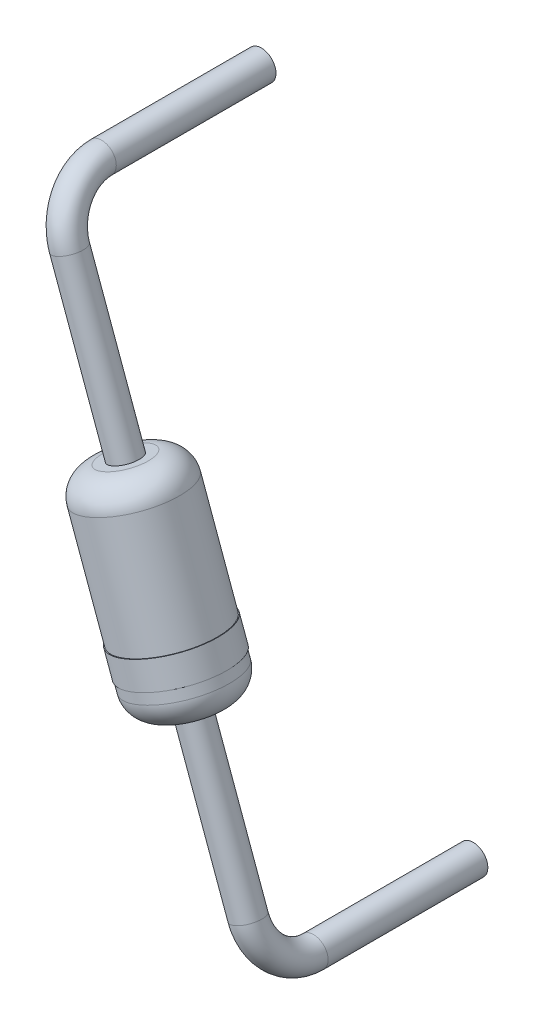
ISO-10303-21;
HEADER;
FILE_DESCRIPTION(('STEP AP214'),'2;1');
FILE_NAME('part.step','',(''),(''),'','','');
FILE_SCHEMA(('AUTOMOTIVE_DESIGN { 1 0 10303 214 1 1 1 1 }'));
ENDSEC;
DATA;
#1=APPLICATION_CONTEXT('core data for automotive mechanical design processes');
#2=APPLICATION_PROTOCOL_DEFINITION('international standard','automotive_design',2000,#1);
#3=PRODUCT_CONTEXT('',#1,'mechanical');
#4=PRODUCT('Part','Part','',(#3));
#5=PRODUCT_RELATED_PRODUCT_CATEGORY('part','',(#4));
#6=PRODUCT_DEFINITION_FORMATION('','',#4);
#7=PRODUCT_DEFINITION_CONTEXT('part definition',#1,'design');
#8=PRODUCT_DEFINITION('design','',#6,#7);
#9=PRODUCT_DEFINITION_SHAPE('','',#8);
#10=(LENGTH_UNIT() NAMED_UNIT(*) SI_UNIT(.MILLI.,.METRE.));
#11=(NAMED_UNIT(*) PLANE_ANGLE_UNIT() SI_UNIT($,.RADIAN.));
#12=(NAMED_UNIT(*) SI_UNIT($,.STERADIAN.) SOLID_ANGLE_UNIT());
#13=UNCERTAINTY_MEASURE_WITH_UNIT(LENGTH_MEASURE(1.E-05),#10,'distance_accuracy_value','');
#14=(GEOMETRIC_REPRESENTATION_CONTEXT(3) GLOBAL_UNCERTAINTY_ASSIGNED_CONTEXT((#13)) GLOBAL_UNIT_ASSIGNED_CONTEXT((#10,
#11,#12)) REPRESENTATION_CONTEXT('',''));
#15=CARTESIAN_POINT('',(0.,0.,0.));
#16=DIRECTION('',(0.,0.,1.));
#17=DIRECTION('',(1.,0.,0.));
#18=AXIS2_PLACEMENT_3D('',#15,#16,#17);
#19=CARTESIAN_POINT('',(56.8879259441125,23.3375751807859,0.1127));
#20=DIRECTION('',(-0.939692620785813,-0.342020143325932,0.));
#21=DIRECTION('',(0.,0.,1.));
#22=AXIS2_PLACEMENT_3D('',#19,#20,#21);
#23=TOROIDAL_SURFACE('',#22,1.,0.3);
#24=CARTESIAN_POINT('',(57.2299460874384,22.39788256,0.1127));
#25=DIRECTION('',(0.,0.,-1.));
#26=DIRECTION('',(0.342020143325932,-0.939692620785813,0.));
#27=AXIS2_PLACEMENT_3D('',#24,#25,#26);
#28=CIRCLE('',#27,0.3);
#29=CARTESIAN_POINT('',(57.1273400444406,22.6797903462358,0.1127));
#30=VERTEX_POINT('',#29);
#31=EDGE_CURVE('E40',#30,#30,#28,.T.);
#32=ORIENTED_EDGE('',*,*,#31,.F.);
#33=EDGE_LOOP('',(#32));
#34=FACE_BOUND('',#33,.T.);
#35=CARTESIAN_POINT('',(56.8879259441125,23.3375751807859,1.1127));
#36=DIRECTION('',(0.342020143325932,-0.939692620785813,0.));
#37=DIRECTION('',(0.,0.,1.));
#38=AXIS2_PLACEMENT_3D('',#35,#36,#37);
#39=CIRCLE('',#38,0.3);
#40=CARTESIAN_POINT('',(56.8879259441125,23.3375751807859,0.8127));
#41=VERTEX_POINT('',#40);
#42=EDGE_CURVE('E11',#41,#41,#39,.T.);
#43=ORIENTED_EDGE('',*,*,#42,.T.);
#44=EDGE_LOOP('',(#43));
#45=FACE_BOUND('',#44,.T.);
#46=ADVANCED_FACE('F16',(#34,#45),#23,.T.);
#47=CARTESIAN_POINT('',(53.228310410525,33.3922862231941,0.1127));
#48=DIRECTION('',(0.939692620785813,0.342020143325932,0.));
#49=DIRECTION('',(0.,0.,-1.));
#50=AXIS2_PLACEMENT_3D('',#47,#48,#49);
#51=TOROIDAL_SURFACE('',#50,1.,0.3);
#52=CARTESIAN_POINT('',(52.8862902671991,34.3319788439798,0.1127));
#53=DIRECTION('',(0.,0.,-1.));
#54=DIRECTION('',(0.342020143325932,-0.939692620785813,0.));
#55=AXIS2_PLACEMENT_3D('',#52,#53,#54);
#56=CIRCLE('',#55,0.3);
#57=CARTESIAN_POINT('',(52.9888963101969,34.0500710577441,0.1127));
#58=VERTEX_POINT('',#57);
#59=EDGE_CURVE('E120',#58,#58,#56,.T.);
#60=ORIENTED_EDGE('',*,*,#59,.F.);
#61=EDGE_LOOP('',(#60));
#62=FACE_BOUND('',#61,.T.);
#63=CARTESIAN_POINT('',(53.228310410525,33.3922862231941,1.1127));
#64=DIRECTION('',(-0.342020143325932,0.939692620785813,0.));
#65=DIRECTION('',(0.,0.,-1.));
#66=AXIS2_PLACEMENT_3D('',#63,#64,#65);
#67=CIRCLE('',#66,0.3);
#68=CARTESIAN_POINT('',(53.228310410525,33.3922862231941,0.8127));
#69=VERTEX_POINT('',#68);
#70=EDGE_CURVE('E27',#69,#69,#67,.T.);
#71=ORIENTED_EDGE('',*,*,#70,.T.);
#72=EDGE_LOOP('',(#71));
#73=FACE_BOUND('',#72,.T.);
#74=ADVANCED_FACE('F178',(#62,#73),#51,.T.);
#75=CARTESIAN_POINT('',(52.8862902671991,34.3319788439798,0.0127000000000011));
#76=DIRECTION('',(0.,0.,-1.));
#77=DIRECTION('',(0.342020143325932,-0.939692620785813,0.));
#78=AXIS2_PLACEMENT_3D('',#75,#76,#77);
#79=CYLINDRICAL_SURFACE('',#78,0.3);
#80=ORIENTED_EDGE('',*,*,#59,.T.);
#81=EDGE_LOOP('',(#80));
#82=FACE_BOUND('',#81,.T.);
#83=CARTESIAN_POINT('',(52.8862902671991,34.3319788439798,-3.1623));
#84=DIRECTION('',(0.,0.,1.));
#85=DIRECTION('',(0.342020143325932,-0.939692620785813,0.));
#86=AXIS2_PLACEMENT_3D('',#83,#84,#85);
#87=CIRCLE('',#86,0.3);
#88=CARTESIAN_POINT('',(52.9888963101969,34.0500710577441,-3.1623));
#89=VERTEX_POINT('',#88);
#90=EDGE_CURVE('E117',#89,#89,#87,.T.);
#91=ORIENTED_EDGE('',*,*,#90,.T.);
#92=EDGE_LOOP('',(#91));
#93=FACE_BOUND('',#92,.T.);
#94=ADVANCED_FACE('F184',(#82,#93),#79,.T.);
#95=CARTESIAN_POINT('',(57.2299460874384,22.39788256,0.0127000000000011));
#96=DIRECTION('',(0.,0.,-1.));
#97=DIRECTION('',(0.342020143325932,-0.939692620785813,0.));
#98=AXIS2_PLACEMENT_3D('',#95,#96,#97);
#99=CYLINDRICAL_SURFACE('',#98,0.3);
#100=ORIENTED_EDGE('',*,*,#31,.T.);
#101=EDGE_LOOP('',(#100));
#102=FACE_BOUND('',#101,.T.);
#103=CARTESIAN_POINT('',(57.2299460874384,22.39788256,-3.1623));
#104=DIRECTION('',(0.,0.,1.));
#105=DIRECTION('',(0.342020143325932,-0.939692620785813,0.));
#106=AXIS2_PLACEMENT_3D('',#103,#104,#105);
#107=CIRCLE('',#106,0.3);
#108=CARTESIAN_POINT('',(57.3325521304362,22.1159747737643,-3.1623));
#109=VERTEX_POINT('',#108);
#110=EDGE_CURVE('E128',#109,#109,#107,.T.);
#111=ORIENTED_EDGE('',*,*,#110,.T.);
#112=EDGE_LOOP('',(#111));
#113=FACE_BOUND('',#112,.T.);
#114=ADVANCED_FACE('F191',(#102,#113),#99,.T.);
#115=CARTESIAN_POINT('',(55.5711483923077,26.9553917708113,1.1127));
#116=DIRECTION('',(0.342020143325932,-0.939692620785813,0.));
#117=DIRECTION('',(0.,0.,1.));
#118=AXIS2_PLACEMENT_3D('',#115,#116,#117);
#119=DEGENERATE_TOROIDAL_SURFACE('',#118,0.5,0.5,.T.);
#120=CARTESIAN_POINT('',(55.5711483923077,26.9553917708113,1.1127));
#121=DIRECTION('',(0.342020143325932,-0.939692620785813,0.));
#122=DIRECTION('',(0.,0.,1.));
#123=AXIS2_PLACEMENT_3D('',#120,#121,#122);
#124=CIRCLE('',#123,1.);
#125=CARTESIAN_POINT('',(55.5711483923077,26.9553917708113,0.112700000000001));
#126=VERTEX_POINT('',#125);
#127=EDGE_CURVE('E135',#126,#126,#124,.T.);
#128=ORIENTED_EDGE('',*,*,#127,.T.);
#129=EDGE_LOOP('',(#128));
#130=FACE_BOUND('',#129,.T.);
#131=CARTESIAN_POINT('',(55.7421584639706,26.4855454604183,1.1127));
#132=DIRECTION('',(0.342020143325932,-0.939692620785813,0.));
#133=DIRECTION('',(0.,0.,1.));
#134=AXIS2_PLACEMENT_3D('',#131,#132,#133);
#135=CIRCLE('',#134,0.5);
#136=CARTESIAN_POINT('',(55.7421584639706,26.4855454604183,1.6127));
#137=VERTEX_POINT('',#136);
#138=EDGE_CURVE('E114',#137,#137,#135,.T.);
#139=ORIENTED_EDGE('',*,*,#138,.F.);
#140=EDGE_LOOP('',(#139));
#141=FACE_BOUND('',#140,.T.);
#142=ADVANCED_FACE('F197',(#130,#141),#119,.T.);
#143=CARTESIAN_POINT('',(55.0581181773188,28.3649307019899,1.1127));
#144=DIRECTION('',(0.342020143325932,-0.939692620785813,0.));
#145=DIRECTION('',(0.,0.,1.));
#146=AXIS2_PLACEMENT_3D('',#143,#144,#145);
#147=CYLINDRICAL_SURFACE('',#146,1.);
#148=CARTESIAN_POINT('',(55.4997147438179,27.151654107026,1.1127));
#149=DIRECTION('',(0.342020143325932,-0.939692620785813,0.));
#150=DIRECTION('',(0.,0.,1.));
#151=AXIS2_PLACEMENT_3D('',#148,#149,#150);
#152=CIRCLE('',#151,1.);
#153=CARTESIAN_POINT('',(55.4997147438179,27.151654107026,0.112700000000001));
#154=VERTEX_POINT('',#153);
#155=EDGE_CURVE('E140',#154,#154,#152,.T.);
#156=ORIENTED_EDGE('',*,*,#155,.T.);
#157=EDGE_LOOP('',(#156));
#158=FACE_BOUND('',#157,.T.);
#159=ORIENTED_EDGE('',*,*,#127,.F.);
#160=EDGE_LOOP('',(#159));
#161=FACE_BOUND('',#160,.T.);
#162=ADVANCED_FACE('F158',(#158,#161),#147,.T.);
#163=CARTESIAN_POINT('',(54.5450879623299,29.7744696331686,1.1127));
#164=DIRECTION('',(0.342020143325932,-0.939692620785813,0.));
#165=DIRECTION('',(0.,0.,1.));
#166=AXIS2_PLACEMENT_3D('',#163,#164,#165);
#167=DEGENERATE_TOROIDAL_SURFACE('',#166,0.5,0.5,.T.);
#168=CARTESIAN_POINT('',(54.3740778906669,30.2443159435615,1.1127));
#169=DIRECTION('',(0.342020143325932,-0.939692620785813,0.));
#170=DIRECTION('',(0.,0.,1.));
#171=AXIS2_PLACEMENT_3D('',#168,#169,#170);
#172=CIRCLE('',#171,0.5);
#173=CARTESIAN_POINT('',(54.3740778906669,30.2443159435615,0.6127));
#174=VERTEX_POINT('',#173);
#175=EDGE_CURVE('E107',#174,#174,#172,.T.);
#176=ORIENTED_EDGE('',*,*,#175,.T.);
#177=EDGE_LOOP('',(#176));
#178=FACE_BOUND('',#177,.T.);
#179=CARTESIAN_POINT('',(54.5450879623299,29.7744696331686,1.1127));
#180=DIRECTION('',(0.342020143325932,-0.939692620785813,0.));
#181=DIRECTION('',(0.,0.,1.));
#182=AXIS2_PLACEMENT_3D('',#179,#180,#181);
#183=CIRCLE('',#182,1.);
#184=CARTESIAN_POINT('',(54.5450879623299,29.7744696331686,2.1127));
#185=VERTEX_POINT('',#184);
#186=EDGE_CURVE('E98',#185,#185,#183,.T.);
#187=ORIENTED_EDGE('',*,*,#186,.F.);
#188=EDGE_LOOP('',(#187));
#189=FACE_BOUND('',#188,.T.);
#190=ADVANCED_FACE('F196',(#178,#189),#167,.T.);
#191=CARTESIAN_POINT('',(55.0581181773188,28.3649307019899,1.1127));
#192=DIRECTION('',(0.342020143325932,-0.939692620785813,0.));
#193=DIRECTION('',(0.,0.,1.));
#194=AXIS2_PLACEMENT_3D('',#191,#192,#193);
#195=CYLINDRICAL_SURFACE('',#194,1.);
#196=ORIENTED_EDGE('',*,*,#186,.T.);
#197=EDGE_LOOP('',(#196));
#198=FACE_BOUND('',#197,.T.);
#199=CARTESIAN_POINT('',(55.3177367192757,27.6516346202922,1.1127));
#200=DIRECTION('',(-0.342020143325932,0.939692620785813,0.));
#201=DIRECTION('',(0.,0.,1.));
#202=AXIS2_PLACEMENT_3D('',#199,#200,#201);
#203=CIRCLE('',#202,1.);
#204=CARTESIAN_POINT('',(55.3177367192757,27.6516346202922,2.1127));
#205=VERTEX_POINT('',#204);
#206=EDGE_CURVE('E95',#205,#205,#203,.T.);
#207=ORIENTED_EDGE('',*,*,#206,.T.);
#208=EDGE_LOOP('',(#207));
#209=FACE_BOUND('',#208,.T.);
#210=ADVANCED_FACE('F204',(#198,#209),#195,.T.);
#211=CARTESIAN_POINT('',(55.4087257315466,27.4016443636595,1.1127));
#212=DIRECTION('',(0.342020143325932,-0.939692620785813,0.));
#213=DIRECTION('',(0.,0.,1.));
#214=AXIS2_PLACEMENT_3D('',#211,#212,#213);
#215=CYLINDRICAL_SURFACE('',#214,1.017447467414);
#216=CARTESIAN_POINT('',(55.3177367192757,27.6516346202922,1.1127));
#217=DIRECTION('',(0.342020143325932,-0.939692620785813,0.));
#218=DIRECTION('',(0.,0.,1.));
#219=AXIS2_PLACEMENT_3D('',#216,#217,#218);
#220=CIRCLE('',#219,1.017447467414);
#221=CARTESIAN_POINT('',(55.3177367192757,27.6516346202922,0.0952525325860012));
#222=VERTEX_POINT('',#221);
#223=EDGE_CURVE('E99',#222,#222,#220,.T.);
#224=ORIENTED_EDGE('',*,*,#223,.T.);
#225=EDGE_LOOP('',(#224));
#226=FACE_BOUND('',#225,.T.);
#227=CARTESIAN_POINT('',(55.4997147438179,27.151654107026,1.1127));
#228=DIRECTION('',(0.342020143325932,-0.939692620785813,0.));
#229=DIRECTION('',(0.,0.,1.));
#230=AXIS2_PLACEMENT_3D('',#227,#228,#229);
#231=CIRCLE('',#230,1.017447467414);
#232=CARTESIAN_POINT('',(55.4997147438179,27.151654107026,2.130147467414));
#233=VERTEX_POINT('',#232);
#234=EDGE_CURVE('E110',#233,#233,#231,.T.);
#235=ORIENTED_EDGE('',*,*,#234,.F.);
#236=EDGE_LOOP('',(#235));
#237=FACE_BOUND('',#236,.T.);
#238=ADVANCED_FACE('F189',(#226,#237),#215,.T.);
#239=CARTESIAN_POINT('',(56.8879259441125,23.3375751807859,1.1127));
#240=DIRECTION('',(-0.342020143325932,0.939692620785813,0.));
#241=DIRECTION('',(0.,0.,1.));
#242=AXIS2_PLACEMENT_3D('',#239,#240,#241);
#243=CYLINDRICAL_SURFACE('',#242,0.3);
#244=ORIENTED_EDGE('',*,*,#42,.F.);
#245=EDGE_LOOP('',(#244));
#246=FACE_BOUND('',#245,.T.);
#247=CARTESIAN_POINT('',(55.7421584639706,26.4855454604183,1.1127));
#248=DIRECTION('',(-0.342020143325932,0.939692620785813,0.));
#249=DIRECTION('',(0.,0.,1.));
#250=AXIS2_PLACEMENT_3D('',#247,#248,#249);
#251=CIRCLE('',#250,0.3);
#252=CARTESIAN_POINT('',(55.7421584639706,26.4855454604183,1.4127));
#253=VERTEX_POINT('',#252);
#254=EDGE_CURVE('E142',#253,#253,#251,.T.);
#255=ORIENTED_EDGE('',*,*,#254,.F.);
#256=EDGE_LOOP('',(#255));
#257=FACE_BOUND('',#256,.T.);
#258=ADVANCED_FACE('F172',(#246,#257),#243,.T.);
#259=CARTESIAN_POINT('',(53.228310410525,33.3922862231941,1.1127));
#260=DIRECTION('',(0.342020143325932,-0.939692620785813,0.));
#261=DIRECTION('',(0.,0.,-1.));
#262=AXIS2_PLACEMENT_3D('',#259,#260,#261);
#263=CYLINDRICAL_SURFACE('',#262,0.3);
#264=ORIENTED_EDGE('',*,*,#70,.F.);
#265=EDGE_LOOP('',(#264));
#266=FACE_BOUND('',#265,.T.);
#267=CARTESIAN_POINT('',(54.3740778906669,30.2443159435615,1.1127));
#268=DIRECTION('',(0.342020143325932,-0.939692620785813,0.));
#269=DIRECTION('',(0.,0.,-1.));
#270=AXIS2_PLACEMENT_3D('',#267,#268,#269);
#271=CIRCLE('',#270,0.3);
#272=CARTESIAN_POINT('',(54.3740778906669,30.2443159435615,0.8127));
#273=VERTEX_POINT('',#272);
#274=EDGE_CURVE('E20',#273,#273,#271,.T.);
#275=ORIENTED_EDGE('',*,*,#274,.F.);
#276=EDGE_LOOP('',(#275));
#277=FACE_BOUND('',#276,.T.);
#278=ADVANCED_FACE('F163',(#266,#277),#263,.T.);
#279=CARTESIAN_POINT('',(55.4997147438179,27.151654107026,2.102450753973));
#280=DIRECTION('',(0.342020143325932,-0.939692620785813,0.));
#281=DIRECTION('',(0.,0.,1.));
#282=AXIS2_PLACEMENT_3D('',#279,#280,#281);
#283=PLANE('',#282);
#284=ORIENTED_EDGE('',*,*,#234,.T.);
#285=EDGE_LOOP('',(#284));
#286=FACE_BOUND('',#285,.T.);
#287=ORIENTED_EDGE('',*,*,#155,.F.);
#288=EDGE_LOOP('',(#287));
#289=FACE_BOUND('',#288,.T.);
#290=ADVANCED_FACE('F161',(#286,#289),#283,.T.);
#291=CARTESIAN_POINT('',(55.3177367192757,27.6516346202922,2.102450753973));
#292=DIRECTION('',(-0.342020143325932,0.939692620785813,0.));
#293=DIRECTION('',(-0.939692620785813,-0.342020143325932,0.));
#294=AXIS2_PLACEMENT_3D('',#291,#292,#293);
#295=PLANE('',#294);
#296=ORIENTED_EDGE('',*,*,#223,.F.);
#297=EDGE_LOOP('',(#296));
#298=FACE_BOUND('',#297,.T.);
#299=ORIENTED_EDGE('',*,*,#206,.F.);
#300=EDGE_LOOP('',(#299));
#301=FACE_BOUND('',#300,.T.);
#302=ADVANCED_FACE('F18',(#298,#301),#295,.T.);
#303=CARTESIAN_POINT('',(55.7421584639706,26.4855454604183,1.3627));
#304=DIRECTION('',(0.342020143325932,-0.939692620785813,0.));
#305=DIRECTION('',(0.,0.,1.));
#306=AXIS2_PLACEMENT_3D('',#303,#304,#305);
#307=PLANE('',#306);
#308=ORIENTED_EDGE('',*,*,#138,.T.);
#309=EDGE_LOOP('',(#308));
#310=FACE_BOUND('',#309,.T.);
#311=ORIENTED_EDGE('',*,*,#254,.T.);
#312=EDGE_LOOP('',(#311));
#313=FACE_BOUND('',#312,.T.);
#314=ADVANCED_FACE('F170',(#310,#313),#307,.T.);
#315=CARTESIAN_POINT('',(54.3740778906669,30.2443159435615,1.3627));
#316=DIRECTION('',(-0.342020143325932,0.939692620785813,0.));
#317=DIRECTION('',(-0.939692620785813,-0.342020143325932,0.));
#318=AXIS2_PLACEMENT_3D('',#315,#316,#317);
#319=PLANE('',#318);
#320=ORIENTED_EDGE('',*,*,#175,.F.);
#321=EDGE_LOOP('',(#320));
#322=FACE_BOUND('',#321,.T.);
#323=ORIENTED_EDGE('',*,*,#274,.T.);
#324=EDGE_LOOP('',(#323));
#325=FACE_BOUND('',#324,.T.);
#326=ADVANCED_FACE('F224',(#322,#325),#319,.T.);
#327=CARTESIAN_POINT('',(57.2299460874384,22.39788256,-3.1623));
#328=DIRECTION('',(0.,0.,-1.));
#329=DIRECTION('',(0.939692620785813,0.342020143325932,0.));
#330=AXIS2_PLACEMENT_3D('',#327,#328,#329);
#331=PLANE('',#330);
#332=ORIENTED_EDGE('',*,*,#110,.F.);
#333=EDGE_LOOP('',(#332));
#334=FACE_BOUND('',#333,.T.);
#335=ADVANCED_FACE('F227',(#334),#331,.T.);
#336=CARTESIAN_POINT('',(52.8862902671991,34.3319788439798,-3.1623));
#337=DIRECTION('',(0.,0.,-1.));
#338=DIRECTION('',(0.939692620785813,0.342020143325932,0.));
#339=AXIS2_PLACEMENT_3D('',#336,#337,#338);
#340=PLANE('',#339);
#341=ORIENTED_EDGE('',*,*,#90,.F.);
#342=EDGE_LOOP('',(#341));
#343=FACE_BOUND('',#342,.T.);
#344=ADVANCED_FACE('F230',(#343),#340,.T.);
#345=CLOSED_SHELL('',(#46,#74,#94,#114,#142,#162,#190,#210,#238,#258,#278,#290,#302,#314,#326,
#335,#344));
#346=MANIFOLD_SOLID_BREP('B1',#345);
#347=ADVANCED_BREP_SHAPE_REPRESENTATION('',(#18,#346),#14);
#348=SHAPE_DEFINITION_REPRESENTATION(#9,#347);
ENDSEC;
END-ISO-10303-21;
